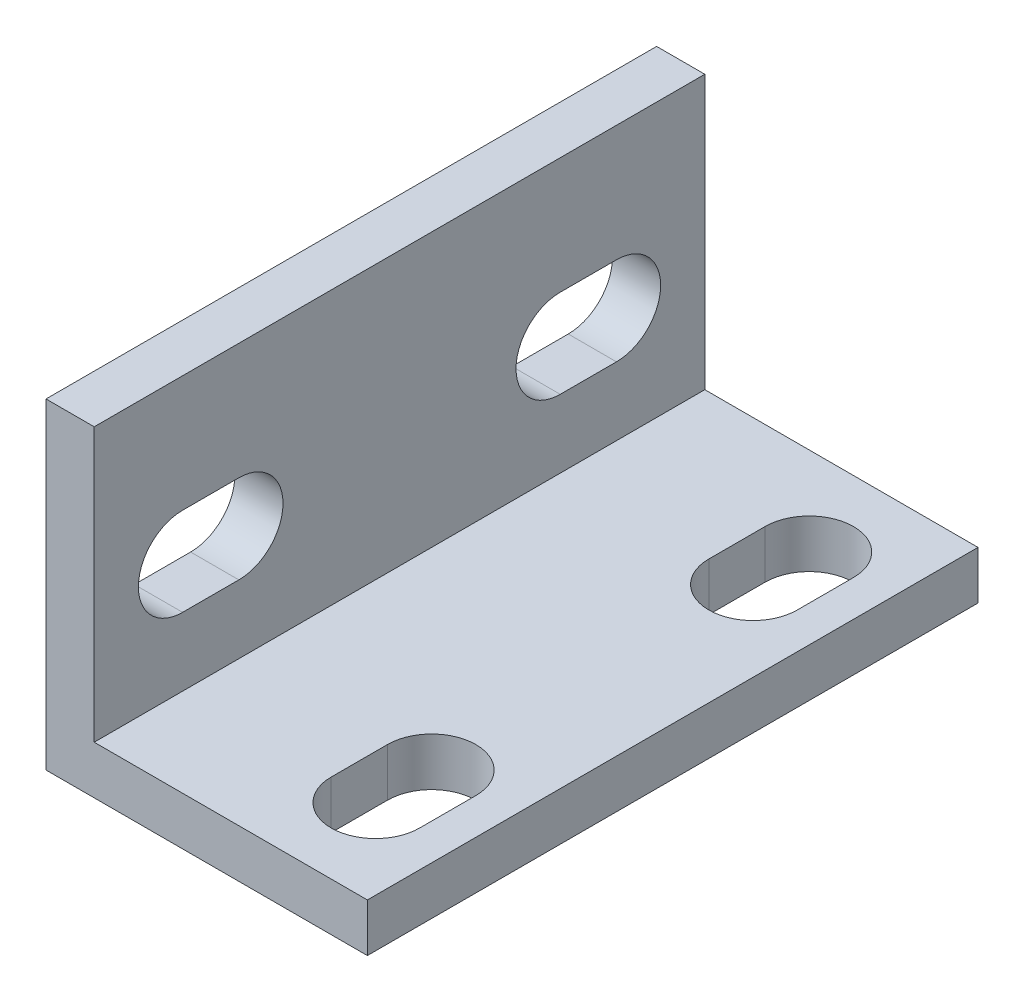
ISO-10303-21;
HEADER;
FILE_DESCRIPTION(('STEP AP214'),'2;1');
FILE_NAME('part.step','',(''),(''),'','','');
FILE_SCHEMA(('AUTOMOTIVE_DESIGN { 1 0 10303 214 1 1 1 1 }'));
ENDSEC;
DATA;
#1=APPLICATION_CONTEXT('core data for automotive mechanical design processes');
#2=APPLICATION_PROTOCOL_DEFINITION('international standard','automotive_design',2000,#1);
#3=PRODUCT_CONTEXT('',#1,'mechanical');
#4=PRODUCT('Part','Part','',(#3));
#5=PRODUCT_RELATED_PRODUCT_CATEGORY('part','',(#4));
#6=PRODUCT_DEFINITION_FORMATION('','',#4);
#7=PRODUCT_DEFINITION_CONTEXT('part definition',#1,'design');
#8=PRODUCT_DEFINITION('design','',#6,#7);
#9=PRODUCT_DEFINITION_SHAPE('','',#8);
#10=(LENGTH_UNIT() NAMED_UNIT(*) SI_UNIT(.MILLI.,.METRE.));
#11=(NAMED_UNIT(*) PLANE_ANGLE_UNIT() SI_UNIT($,.RADIAN.));
#12=(NAMED_UNIT(*) SI_UNIT($,.STERADIAN.) SOLID_ANGLE_UNIT());
#13=UNCERTAINTY_MEASURE_WITH_UNIT(LENGTH_MEASURE(1.E-05),#10,'distance_accuracy_value','');
#14=(GEOMETRIC_REPRESENTATION_CONTEXT(3) GLOBAL_UNCERTAINTY_ASSIGNED_CONTEXT((#13)) GLOBAL_UNIT_ASSIGNED_CONTEXT((#10,
#11,#12)) REPRESENTATION_CONTEXT('',''));
#15=CARTESIAN_POINT('',(0.,0.,0.));
#16=DIRECTION('',(0.,0.,1.));
#17=DIRECTION('',(1.,0.,0.));
#18=AXIS2_PLACEMENT_3D('',#15,#16,#17);
#19=CARTESIAN_POINT('',(10.,20.,-19.));
#20=DIRECTION('',(-1.,0.,0.));
#21=DIRECTION('',(0.,0.,1.));
#22=AXIS2_PLACEMENT_3D('',#19,#20,#21);
#23=PLANE('',#22);
#24=DIRECTION('',(0.,-1.,0.));
#25=VECTOR('',#24,1.);
#26=CARTESIAN_POINT('',(10.,20.,-19.));
#27=LINE('',#26,#25);
#28=CARTESIAN_POINT('',(10.,3.,-19.));
#29=VERTEX_POINT('',#28);
#30=CARTESIAN_POINT('',(10.,0.,-19.));
#31=VERTEX_POINT('',#30);
#32=EDGE_CURVE('E11',#29,#31,#27,.T.);
#33=ORIENTED_EDGE('',*,*,#32,.F.);
#34=DIRECTION('',(0.,0.,1.));
#35=VECTOR('',#34,1.);
#36=CARTESIAN_POINT('',(10.,3.,-19.));
#37=LINE('',#36,#35);
#38=CARTESIAN_POINT('',(10.,3.,19.));
#39=VERTEX_POINT('',#38);
#40=EDGE_CURVE('E332',#29,#39,#37,.T.);
#41=ORIENTED_EDGE('',*,*,#40,.T.);
#42=DIRECTION('',(0.,-1.,0.));
#43=VECTOR('',#42,1.);
#44=CARTESIAN_POINT('',(10.,20.,19.));
#45=LINE('',#44,#43);
#46=CARTESIAN_POINT('',(10.,0.,19.));
#47=VERTEX_POINT('',#46);
#48=EDGE_CURVE('E347',#39,#47,#45,.T.);
#49=ORIENTED_EDGE('',*,*,#48,.T.);
#50=DIRECTION('',(0.,0.,-1.));
#51=VECTOR('',#50,1.);
#52=CARTESIAN_POINT('',(10.,0.,-19.));
#53=LINE('',#52,#51);
#54=EDGE_CURVE('E335',#47,#31,#53,.T.);
#55=ORIENTED_EDGE('',*,*,#54,.T.);
#56=EDGE_LOOP('',(#33,#41,#49,#55));
#57=FACE_BOUND('',#56,.T.);
#58=ADVANCED_FACE('F39',(#57),#23,.F.);
#59=CARTESIAN_POINT('',(-10.,20.,-19.));
#60=DIRECTION('',(0.,0.,1.));
#61=DIRECTION('',(1.,0.,0.));
#62=AXIS2_PLACEMENT_3D('',#59,#60,#61);
#63=PLANE('',#62);
#64=DIRECTION('',(0.,-1.,0.));
#65=VECTOR('',#64,1.);
#66=CARTESIAN_POINT('',(-7.,20.,-19.));
#67=LINE('',#66,#65);
#68=CARTESIAN_POINT('',(-7.,20.,-19.));
#69=VERTEX_POINT('',#68);
#70=CARTESIAN_POINT('',(-7.,3.,-19.));
#71=VERTEX_POINT('',#70);
#72=EDGE_CURVE('E321',#69,#71,#67,.T.);
#73=ORIENTED_EDGE('',*,*,#72,.T.);
#74=DIRECTION('',(1.,0.,0.));
#75=VECTOR('',#74,1.);
#76=CARTESIAN_POINT('',(10.,3.,-19.));
#77=LINE('',#76,#75);
#78=EDGE_CURVE('E324',#71,#29,#77,.T.);
#79=ORIENTED_EDGE('',*,*,#78,.T.);
#80=ORIENTED_EDGE('',*,*,#32,.T.);
#81=DIRECTION('',(-1.,0.,0.));
#82=VECTOR('',#81,1.);
#83=CARTESIAN_POINT('',(-10.,0.,-19.));
#84=LINE('',#83,#82);
#85=CARTESIAN_POINT('',(-10.,0.,-19.));
#86=VERTEX_POINT('',#85);
#87=EDGE_CURVE('E350',#31,#86,#84,.T.);
#88=ORIENTED_EDGE('',*,*,#87,.T.);
#89=DIRECTION('',(0.,-1.,0.));
#90=VECTOR('',#89,1.);
#91=CARTESIAN_POINT('',(-10.,20.,-19.));
#92=LINE('',#91,#90);
#93=CARTESIAN_POINT('',(-10.,20.,-19.));
#94=VERTEX_POINT('',#93);
#95=EDGE_CURVE('E46',#94,#86,#92,.T.);
#96=ORIENTED_EDGE('',*,*,#95,.F.);
#97=DIRECTION('',(-1.,0.,0.));
#98=VECTOR('',#97,1.);
#99=CARTESIAN_POINT('',(-10.,20.,-19.));
#100=LINE('',#99,#98);
#101=EDGE_CURVE('E339',#69,#94,#100,.T.);
#102=ORIENTED_EDGE('',*,*,#101,.F.);
#103=EDGE_LOOP('',(#73,#79,#80,#88,#96,#102));
#104=FACE_BOUND('',#103,.T.);
#105=ADVANCED_FACE('F381',(#104),#63,.F.);
#106=CARTESIAN_POINT('',(-10.,20.,-19.));
#107=DIRECTION('',(1.,0.,0.));
#108=DIRECTION('',(0.,0.,-1.));
#109=AXIS2_PLACEMENT_3D('',#106,#107,#108);
#110=PLANE('',#109);
#111=DIRECTION('',(0.,0.,1.));
#112=VECTOR('',#111,1.);
#113=CARTESIAN_POINT('',(-10.,12.75,13.5));
#114=LINE('',#113,#112);
#115=CARTESIAN_POINT('',(-10.,12.75,10.));
#116=VERTEX_POINT('',#115);
#117=CARTESIAN_POINT('',(-10.,12.75,13.5));
#118=VERTEX_POINT('',#117);
#119=EDGE_CURVE('E198',#116,#118,#114,.T.);
#120=ORIENTED_EDGE('',*,*,#119,.T.);
#121=CARTESIAN_POINT('',(-10.,10.,13.5));
#122=DIRECTION('',(1.,0.,0.));
#123=DIRECTION('',(0.,1.,0.));
#124=AXIS2_PLACEMENT_3D('',#121,#122,#123);
#125=CIRCLE('',#124,2.75);
#126=CARTESIAN_POINT('',(-10.,7.25,13.5));
#127=VERTEX_POINT('',#126);
#128=EDGE_CURVE('E190',#118,#127,#125,.T.);
#129=ORIENTED_EDGE('',*,*,#128,.T.);
#130=DIRECTION('',(0.,0.,-1.));
#131=VECTOR('',#130,1.);
#132=CARTESIAN_POINT('',(-10.,7.25,13.5));
#133=LINE('',#132,#131);
#134=CARTESIAN_POINT('',(-10.,7.25,10.));
#135=VERTEX_POINT('',#134);
#136=EDGE_CURVE('E201',#127,#135,#133,.T.);
#137=ORIENTED_EDGE('',*,*,#136,.T.);
#138=CARTESIAN_POINT('',(-10.,9.99999999999999,10.));
#139=DIRECTION('',(1.,0.,0.));
#140=DIRECTION('',(0.,1.,0.));
#141=AXIS2_PLACEMENT_3D('',#138,#139,#140);
#142=CIRCLE('',#141,2.75);
#143=EDGE_CURVE('E53',#135,#116,#142,.T.);
#144=ORIENTED_EDGE('',*,*,#143,.T.);
#145=EDGE_LOOP('',(#120,#129,#137,#144));
#146=FACE_BOUND('',#145,.T.);
#147=DIRECTION('',(0.,0.,-1.));
#148=VECTOR('',#147,1.);
#149=CARTESIAN_POINT('',(-10.,7.25,-13.5));
#150=LINE('',#149,#148);
#151=CARTESIAN_POINT('',(-10.,7.25,-10.));
#152=VERTEX_POINT('',#151);
#153=CARTESIAN_POINT('',(-10.,7.25,-13.5));
#154=VERTEX_POINT('',#153);
#155=EDGE_CURVE('E231',#152,#154,#150,.T.);
#156=ORIENTED_EDGE('',*,*,#155,.T.);
#157=CARTESIAN_POINT('',(-10.,10.,-13.5));
#158=DIRECTION('',(1.,0.,0.));
#159=DIRECTION('',(0.,-1.,0.));
#160=AXIS2_PLACEMENT_3D('',#157,#158,#159);
#161=CIRCLE('',#160,2.75);
#162=CARTESIAN_POINT('',(-10.,12.75,-13.5));
#163=VERTEX_POINT('',#162);
#164=EDGE_CURVE('E242',#154,#163,#161,.T.);
#165=ORIENTED_EDGE('',*,*,#164,.T.);
#166=DIRECTION('',(0.,0.,1.));
#167=VECTOR('',#166,1.);
#168=CARTESIAN_POINT('',(-10.,12.75,-13.5));
#169=LINE('',#168,#167);
#170=CARTESIAN_POINT('',(-10.,12.75,-10.));
#171=VERTEX_POINT('',#170);
#172=EDGE_CURVE('E252',#163,#171,#169,.T.);
#173=ORIENTED_EDGE('',*,*,#172,.T.);
#174=CARTESIAN_POINT('',(-10.,9.99999999999999,-10.));
#175=DIRECTION('',(1.,0.,0.));
#176=DIRECTION('',(0.,-1.,0.));
#177=AXIS2_PLACEMENT_3D('',#174,#175,#176);
#178=CIRCLE('',#177,2.75);
#179=EDGE_CURVE('E61',#171,#152,#178,.T.);
#180=ORIENTED_EDGE('',*,*,#179,.T.);
#181=EDGE_LOOP('',(#156,#165,#173,#180));
#182=FACE_BOUND('',#181,.T.);
#183=DIRECTION('',(0.,0.,1.));
#184=VECTOR('',#183,1.);
#185=CARTESIAN_POINT('',(-10.,0.,-19.));
#186=LINE('',#185,#184);
#187=CARTESIAN_POINT('',(-9.99999999999999,0.,19.));
#188=VERTEX_POINT('',#187);
#189=EDGE_CURVE('E352',#86,#188,#186,.T.);
#190=ORIENTED_EDGE('',*,*,#189,.T.);
#191=DIRECTION('',(0.,-1.,0.));
#192=VECTOR('',#191,1.);
#193=CARTESIAN_POINT('',(-9.99999999999999,20.,19.));
#194=LINE('',#193,#192);
#195=CARTESIAN_POINT('',(-9.99999999999999,20.,19.));
#196=VERTEX_POINT('',#195);
#197=EDGE_CURVE('E357',#196,#188,#194,.T.);
#198=ORIENTED_EDGE('',*,*,#197,.F.);
#199=DIRECTION('',(0.,0.,1.));
#200=VECTOR('',#199,1.);
#201=CARTESIAN_POINT('',(-10.,20.,-19.));
#202=LINE('',#201,#200);
#203=EDGE_CURVE('E341',#94,#196,#202,.T.);
#204=ORIENTED_EDGE('',*,*,#203,.F.);
#205=ORIENTED_EDGE('',*,*,#95,.T.);
#206=EDGE_LOOP('',(#190,#198,#204,#205));
#207=FACE_BOUND('',#206,.T.);
#208=ADVANCED_FACE('F205',(#146,#182,#207),#110,.F.);
#209=CARTESIAN_POINT('',(-9.99999999999999,20.,19.));
#210=DIRECTION('',(0.,0.,-1.));
#211=DIRECTION('',(-1.,0.,0.));
#212=AXIS2_PLACEMENT_3D('',#209,#210,#211);
#213=PLANE('',#212);
#214=ORIENTED_EDGE('',*,*,#48,.F.);
#215=DIRECTION('',(1.,0.,0.));
#216=VECTOR('',#215,1.);
#217=CARTESIAN_POINT('',(10.,3.,19.));
#218=LINE('',#217,#216);
#219=CARTESIAN_POINT('',(-7.,3.,19.));
#220=VERTEX_POINT('',#219);
#221=EDGE_CURVE('E325',#220,#39,#218,.T.);
#222=ORIENTED_EDGE('',*,*,#221,.F.);
#223=DIRECTION('',(0.,-1.,0.));
#224=VECTOR('',#223,1.);
#225=CARTESIAN_POINT('',(-7.,20.,19.));
#226=LINE('',#225,#224);
#227=CARTESIAN_POINT('',(-7.,20.,19.));
#228=VERTEX_POINT('',#227);
#229=EDGE_CURVE('E284',#228,#220,#226,.T.);
#230=ORIENTED_EDGE('',*,*,#229,.F.);
#231=DIRECTION('',(1.,0.,0.));
#232=VECTOR('',#231,1.);
#233=CARTESIAN_POINT('',(-9.99999999999999,20.,19.));
#234=LINE('',#233,#232);
#235=EDGE_CURVE('E344',#196,#228,#234,.T.);
#236=ORIENTED_EDGE('',*,*,#235,.F.);
#237=ORIENTED_EDGE('',*,*,#197,.T.);
#238=DIRECTION('',(1.,0.,0.));
#239=VECTOR('',#238,1.);
#240=CARTESIAN_POINT('',(-9.99999999999999,0.,19.));
#241=LINE('',#240,#239);
#242=EDGE_CURVE('E342',#188,#47,#241,.T.);
#243=ORIENTED_EDGE('',*,*,#242,.T.);
#244=EDGE_LOOP('',(#214,#222,#230,#236,#237,#243));
#245=FACE_BOUND('',#244,.T.);
#246=ADVANCED_FACE('F374',(#245),#213,.F.);
#247=CARTESIAN_POINT('',(0.,20.,0.));
#248=DIRECTION('',(0.,1.,0.));
#249=DIRECTION('',(0.,0.,1.));
#250=AXIS2_PLACEMENT_3D('',#247,#248,#249);
#251=PLANE('',#250);
#252=DIRECTION('',(0.,0.,1.));
#253=VECTOR('',#252,1.);
#254=CARTESIAN_POINT('',(-7.,20.,-19.));
#255=LINE('',#254,#253);
#256=EDGE_CURVE('E328',#69,#228,#255,.T.);
#257=ORIENTED_EDGE('',*,*,#256,.F.);
#258=ORIENTED_EDGE('',*,*,#101,.T.);
#259=ORIENTED_EDGE('',*,*,#203,.T.);
#260=ORIENTED_EDGE('',*,*,#235,.T.);
#261=EDGE_LOOP('',(#257,#258,#259,#260));
#262=FACE_BOUND('',#261,.T.);
#263=ADVANCED_FACE('F380',(#262),#251,.T.);
#264=CARTESIAN_POINT('',(0.,0.,0.));
#265=DIRECTION('',(0.,1.,0.));
#266=DIRECTION('',(0.,0.,1.));
#267=AXIS2_PLACEMENT_3D('',#264,#265,#266);
#268=PLANE('',#267);
#269=DIRECTION('',(0.,0.,-1.));
#270=VECTOR('',#269,1.);
#271=CARTESIAN_POINT('',(7.75,0.,10.));
#272=LINE('',#271,#270);
#273=CARTESIAN_POINT('',(7.75,0.,13.5));
#274=VERTEX_POINT('',#273);
#275=CARTESIAN_POINT('',(7.75,0.,10.));
#276=VERTEX_POINT('',#275);
#277=EDGE_CURVE('E267',#274,#276,#272,.T.);
#278=ORIENTED_EDGE('',*,*,#277,.T.);
#279=CARTESIAN_POINT('',(5.,0.,10.));
#280=DIRECTION('',(0.,1.,0.));
#281=DIRECTION('',(-1.,0.,0.));
#282=AXIS2_PLACEMENT_3D('',#279,#280,#281);
#283=CIRCLE('',#282,2.75);
#284=CARTESIAN_POINT('',(2.25,0.,10.));
#285=VERTEX_POINT('',#284);
#286=EDGE_CURVE('E257',#276,#285,#283,.T.);
#287=ORIENTED_EDGE('',*,*,#286,.T.);
#288=DIRECTION('',(0.,0.,1.));
#289=VECTOR('',#288,1.);
#290=CARTESIAN_POINT('',(2.25,0.,10.));
#291=LINE('',#290,#289);
#292=CARTESIAN_POINT('',(2.25,0.,13.5));
#293=VERTEX_POINT('',#292);
#294=EDGE_CURVE('E260',#285,#293,#291,.T.);
#295=ORIENTED_EDGE('',*,*,#294,.T.);
#296=CARTESIAN_POINT('',(5.,0.,13.5));
#297=DIRECTION('',(0.,1.,0.));
#298=DIRECTION('',(-1.,0.,0.));
#299=AXIS2_PLACEMENT_3D('',#296,#297,#298);
#300=CIRCLE('',#299,2.75);
#301=EDGE_CURVE('E264',#293,#274,#300,.T.);
#302=ORIENTED_EDGE('',*,*,#301,.T.);
#303=EDGE_LOOP('',(#278,#287,#295,#302));
#304=FACE_BOUND('',#303,.T.);
#305=DIRECTION('',(0.,0.,1.));
#306=VECTOR('',#305,1.);
#307=CARTESIAN_POINT('',(2.25000000000001,0.,-10.));
#308=LINE('',#307,#306);
#309=CARTESIAN_POINT('',(2.25000000000001,0.,-13.5));
#310=VERTEX_POINT('',#309);
#311=CARTESIAN_POINT('',(2.25000000000001,0.,-10.));
#312=VERTEX_POINT('',#311);
#313=EDGE_CURVE('E294',#310,#312,#308,.T.);
#314=ORIENTED_EDGE('',*,*,#313,.T.);
#315=CARTESIAN_POINT('',(5.00000000000001,0.,-9.99999999999999));
#316=DIRECTION('',(0.,1.,0.));
#317=DIRECTION('',(1.,0.,0.));
#318=AXIS2_PLACEMENT_3D('',#315,#316,#317);
#319=CIRCLE('',#318,2.75);
#320=CARTESIAN_POINT('',(7.75000000000001,0.,-9.99999999999999));
#321=VERTEX_POINT('',#320);
#322=EDGE_CURVE('E304',#312,#321,#319,.T.);
#323=ORIENTED_EDGE('',*,*,#322,.T.);
#324=DIRECTION('',(0.,0.,-1.));
#325=VECTOR('',#324,1.);
#326=CARTESIAN_POINT('',(7.75000000000001,0.,-9.99999999999999));
#327=LINE('',#326,#325);
#328=CARTESIAN_POINT('',(7.75000000000001,0.,-13.5));
#329=VERTEX_POINT('',#328);
#330=EDGE_CURVE('E316',#321,#329,#327,.T.);
#331=ORIENTED_EDGE('',*,*,#330,.T.);
#332=CARTESIAN_POINT('',(5.00000000000001,0.,-13.5));
#333=DIRECTION('',(0.,1.,0.));
#334=DIRECTION('',(1.,0.,0.));
#335=AXIS2_PLACEMENT_3D('',#332,#333,#334);
#336=CIRCLE('',#335,2.75);
#337=EDGE_CURVE('E313',#329,#310,#336,.T.);
#338=ORIENTED_EDGE('',*,*,#337,.T.);
#339=EDGE_LOOP('',(#314,#323,#331,#338));
#340=FACE_BOUND('',#339,.T.);
#341=ORIENTED_EDGE('',*,*,#54,.F.);
#342=ORIENTED_EDGE('',*,*,#242,.F.);
#343=ORIENTED_EDGE('',*,*,#189,.F.);
#344=ORIENTED_EDGE('',*,*,#87,.F.);
#345=EDGE_LOOP('',(#341,#342,#343,#344));
#346=FACE_BOUND('',#345,.T.);
#347=ADVANCED_FACE('F371',(#304,#340,#346),#268,.F.);
#348=CARTESIAN_POINT('',(10.,3.,-19.));
#349=DIRECTION('',(0.,-1.,0.));
#350=DIRECTION('',(1.,0.,0.));
#351=AXIS2_PLACEMENT_3D('',#348,#349,#350);
#352=PLANE('',#351);
#353=DIRECTION('',(0.,0.,1.));
#354=VECTOR('',#353,1.);
#355=CARTESIAN_POINT('',(2.25,3.,10.));
#356=LINE('',#355,#354);
#357=CARTESIAN_POINT('',(2.25,3.,10.));
#358=VERTEX_POINT('',#357);
#359=CARTESIAN_POINT('',(2.25,3.,13.5));
#360=VERTEX_POINT('',#359);
#361=EDGE_CURVE('E273',#358,#360,#356,.T.);
#362=ORIENTED_EDGE('',*,*,#361,.F.);
#363=CARTESIAN_POINT('',(5.,3.,10.));
#364=DIRECTION('',(0.,1.,0.));
#365=DIRECTION('',(-1.,0.,0.));
#366=AXIS2_PLACEMENT_3D('',#363,#364,#365);
#367=CIRCLE('',#366,2.75);
#368=CARTESIAN_POINT('',(7.75,3.,10.));
#369=VERTEX_POINT('',#368);
#370=EDGE_CURVE('E271',#369,#358,#367,.T.);
#371=ORIENTED_EDGE('',*,*,#370,.F.);
#372=DIRECTION('',(0.,0.,-1.));
#373=VECTOR('',#372,1.);
#374=CARTESIAN_POINT('',(7.75,3.,10.));
#375=LINE('',#374,#373);
#376=CARTESIAN_POINT('',(7.75,3.,13.5));
#377=VERTEX_POINT('',#376);
#378=EDGE_CURVE('E261',#377,#369,#375,.T.);
#379=ORIENTED_EDGE('',*,*,#378,.F.);
#380=CARTESIAN_POINT('',(5.,3.,13.5));
#381=DIRECTION('',(0.,1.,0.));
#382=DIRECTION('',(-1.,0.,0.));
#383=AXIS2_PLACEMENT_3D('',#380,#381,#382);
#384=CIRCLE('',#383,2.75);
#385=EDGE_CURVE('E277',#360,#377,#384,.T.);
#386=ORIENTED_EDGE('',*,*,#385,.F.);
#387=EDGE_LOOP('',(#362,#371,#379,#386));
#388=FACE_BOUND('',#387,.T.);
#389=DIRECTION('',(0.,0.,-1.));
#390=VECTOR('',#389,1.);
#391=CARTESIAN_POINT('',(7.75000000000001,3.,-9.99999999999999));
#392=LINE('',#391,#390);
#393=CARTESIAN_POINT('',(7.75000000000001,3.,-9.99999999999999));
#394=VERTEX_POINT('',#393);
#395=CARTESIAN_POINT('',(7.75000000000001,3.,-13.5));
#396=VERTEX_POINT('',#395);
#397=EDGE_CURVE('E307',#394,#396,#392,.T.);
#398=ORIENTED_EDGE('',*,*,#397,.F.);
#399=CARTESIAN_POINT('',(5.00000000000001,3.,-9.99999999999999));
#400=DIRECTION('',(0.,1.,0.));
#401=DIRECTION('',(1.,0.,0.));
#402=AXIS2_PLACEMENT_3D('',#399,#400,#401);
#403=CIRCLE('',#402,2.75);
#404=CARTESIAN_POINT('',(2.25000000000001,3.,-10.));
#405=VERTEX_POINT('',#404);
#406=EDGE_CURVE('E274',#405,#394,#403,.T.);
#407=ORIENTED_EDGE('',*,*,#406,.F.);
#408=DIRECTION('',(0.,0.,1.));
#409=VECTOR('',#408,1.);
#410=CARTESIAN_POINT('',(2.25000000000001,3.,-10.));
#411=LINE('',#410,#409);
#412=CARTESIAN_POINT('',(2.25000000000001,3.,-13.5));
#413=VERTEX_POINT('',#412);
#414=EDGE_CURVE('E300',#413,#405,#411,.T.);
#415=ORIENTED_EDGE('',*,*,#414,.F.);
#416=CARTESIAN_POINT('',(5.00000000000001,3.,-13.5));
#417=DIRECTION('',(0.,1.,0.));
#418=DIRECTION('',(1.,0.,0.));
#419=AXIS2_PLACEMENT_3D('',#416,#417,#418);
#420=CIRCLE('',#419,2.75);
#421=EDGE_CURVE('E303',#396,#413,#420,.T.);
#422=ORIENTED_EDGE('',*,*,#421,.F.);
#423=EDGE_LOOP('',(#398,#407,#415,#422));
#424=FACE_BOUND('',#423,.T.);
#425=ORIENTED_EDGE('',*,*,#221,.T.);
#426=ORIENTED_EDGE('',*,*,#40,.F.);
#427=ORIENTED_EDGE('',*,*,#78,.F.);
#428=DIRECTION('',(0.,0.,1.));
#429=VECTOR('',#428,1.);
#430=CARTESIAN_POINT('',(-7.,3.,-19.));
#431=LINE('',#430,#429);
#432=EDGE_CURVE('E336',#71,#220,#431,.T.);
#433=ORIENTED_EDGE('',*,*,#432,.T.);
#434=EDGE_LOOP('',(#425,#426,#427,#433));
#435=FACE_BOUND('',#434,.T.);
#436=ADVANCED_FACE('F387',(#388,#424,#435),#352,.F.);
#437=CARTESIAN_POINT('',(-7.,20.,-19.));
#438=DIRECTION('',(-1.,0.,0.));
#439=DIRECTION('',(0.,-1.,0.));
#440=AXIS2_PLACEMENT_3D('',#437,#438,#439);
#441=PLANE('',#440);
#442=DIRECTION('',(0.,0.,-1.));
#443=VECTOR('',#442,1.);
#444=CARTESIAN_POINT('',(-7.,7.25,13.5));
#445=LINE('',#444,#443);
#446=CARTESIAN_POINT('',(-7.,7.25,13.5));
#447=VERTEX_POINT('',#446);
#448=CARTESIAN_POINT('',(-7.,7.25,10.));
#449=VERTEX_POINT('',#448);
#450=EDGE_CURVE('E217',#447,#449,#445,.T.);
#451=ORIENTED_EDGE('',*,*,#450,.F.);
#452=CARTESIAN_POINT('',(-7.,10.,13.5));
#453=DIRECTION('',(1.,0.,0.));
#454=DIRECTION('',(0.,1.,0.));
#455=AXIS2_PLACEMENT_3D('',#452,#453,#454);
#456=CIRCLE('',#455,2.75);
#457=CARTESIAN_POINT('',(-7.,12.75,13.5));
#458=VERTEX_POINT('',#457);
#459=EDGE_CURVE('E193',#458,#447,#456,.T.);
#460=ORIENTED_EDGE('',*,*,#459,.F.);
#461=DIRECTION('',(0.,0.,1.));
#462=VECTOR('',#461,1.);
#463=CARTESIAN_POINT('',(-7.,12.75,13.5));
#464=LINE('',#463,#462);
#465=CARTESIAN_POINT('',(-7.,12.75,10.));
#466=VERTEX_POINT('',#465);
#467=EDGE_CURVE('E208',#466,#458,#464,.T.);
#468=ORIENTED_EDGE('',*,*,#467,.F.);
#469=CARTESIAN_POINT('',(-7.,9.99999999999999,10.));
#470=DIRECTION('',(1.,0.,0.));
#471=DIRECTION('',(0.,1.,0.));
#472=AXIS2_PLACEMENT_3D('',#469,#470,#471);
#473=CIRCLE('',#472,2.75);
#474=EDGE_CURVE('E211',#449,#466,#473,.T.);
#475=ORIENTED_EDGE('',*,*,#474,.F.);
#476=EDGE_LOOP('',(#451,#460,#468,#475));
#477=FACE_BOUND('',#476,.T.);
#478=DIRECTION('',(0.,0.,1.));
#479=VECTOR('',#478,1.);
#480=CARTESIAN_POINT('',(-7.,12.75,-13.5));
#481=LINE('',#480,#479);
#482=CARTESIAN_POINT('',(-7.,12.75,-13.5));
#483=VERTEX_POINT('',#482);
#484=CARTESIAN_POINT('',(-7.,12.75,-10.));
#485=VERTEX_POINT('',#484);
#486=EDGE_CURVE('E245',#483,#485,#481,.T.);
#487=ORIENTED_EDGE('',*,*,#486,.F.);
#488=CARTESIAN_POINT('',(-7.,10.,-13.5));
#489=DIRECTION('',(1.,0.,0.));
#490=DIRECTION('',(0.,-1.,0.));
#491=AXIS2_PLACEMENT_3D('',#488,#489,#490);
#492=CIRCLE('',#491,2.75);
#493=CARTESIAN_POINT('',(-7.,7.25,-13.5));
#494=VERTEX_POINT('',#493);
#495=EDGE_CURVE('E218',#494,#483,#492,.T.);
#496=ORIENTED_EDGE('',*,*,#495,.F.);
#497=DIRECTION('',(0.,0.,-1.));
#498=VECTOR('',#497,1.);
#499=CARTESIAN_POINT('',(-7.,7.25,-13.5));
#500=LINE('',#499,#498);
#501=CARTESIAN_POINT('',(-7.,7.25,-10.));
#502=VERTEX_POINT('',#501);
#503=EDGE_CURVE('E238',#502,#494,#500,.T.);
#504=ORIENTED_EDGE('',*,*,#503,.F.);
#505=CARTESIAN_POINT('',(-7.,9.99999999999999,-10.));
#506=DIRECTION('',(1.,0.,0.));
#507=DIRECTION('',(0.,-1.,0.));
#508=AXIS2_PLACEMENT_3D('',#505,#506,#507);
#509=CIRCLE('',#508,2.75);
#510=EDGE_CURVE('E241',#485,#502,#509,.T.);
#511=ORIENTED_EDGE('',*,*,#510,.F.);
#512=EDGE_LOOP('',(#487,#496,#504,#511));
#513=FACE_BOUND('',#512,.T.);
#514=ORIENTED_EDGE('',*,*,#229,.T.);
#515=ORIENTED_EDGE('',*,*,#432,.F.);
#516=ORIENTED_EDGE('',*,*,#72,.F.);
#517=ORIENTED_EDGE('',*,*,#256,.T.);
#518=EDGE_LOOP('',(#514,#515,#516,#517));
#519=FACE_BOUND('',#518,.T.);
#520=ADVANCED_FACE('F385',(#477,#513,#519),#441,.F.);
#521=CARTESIAN_POINT('',(5.00000000000001,0.,-9.99999999999999));
#522=DIRECTION('',(0.,1.,0.));
#523=DIRECTION('',(-1.,0.,0.));
#524=AXIS2_PLACEMENT_3D('',#521,#522,#523);
#525=CYLINDRICAL_SURFACE('',#524,2.75);
#526=ORIENTED_EDGE('',*,*,#406,.T.);
#527=DIRECTION('',(0.,1.,0.));
#528=VECTOR('',#527,1.);
#529=CARTESIAN_POINT('',(7.75000000000001,0.,-9.99999999999999));
#530=LINE('',#529,#528);
#531=EDGE_CURVE('E291',#321,#394,#530,.T.);
#532=ORIENTED_EDGE('',*,*,#531,.F.);
#533=ORIENTED_EDGE('',*,*,#322,.F.);
#534=DIRECTION('',(0.,1.,0.));
#535=VECTOR('',#534,1.);
#536=CARTESIAN_POINT('',(2.25000000000001,0.,-10.));
#537=LINE('',#536,#535);
#538=EDGE_CURVE('E224',#312,#405,#537,.T.);
#539=ORIENTED_EDGE('',*,*,#538,.T.);
#540=EDGE_LOOP('',(#526,#532,#533,#539));
#541=FACE_BOUND('',#540,.T.);
#542=ADVANCED_FACE('F407',(#541),#525,.F.);
#543=CARTESIAN_POINT('',(2.25000000000001,0.,-10.));
#544=DIRECTION('',(-1.,0.,0.));
#545=DIRECTION('',(0.,0.,1.));
#546=AXIS2_PLACEMENT_3D('',#543,#544,#545);
#547=PLANE('',#546);
#548=ORIENTED_EDGE('',*,*,#414,.T.);
#549=ORIENTED_EDGE('',*,*,#538,.F.);
#550=ORIENTED_EDGE('',*,*,#313,.F.);
#551=DIRECTION('',(0.,1.,0.));
#552=VECTOR('',#551,1.);
#553=CARTESIAN_POINT('',(2.25000000000001,0.,-13.5));
#554=LINE('',#553,#552);
#555=EDGE_CURVE('E297',#310,#413,#554,.T.);
#556=ORIENTED_EDGE('',*,*,#555,.T.);
#557=EDGE_LOOP('',(#548,#549,#550,#556));
#558=FACE_BOUND('',#557,.T.);
#559=ADVANCED_FACE('F412',(#558),#547,.F.);
#560=CARTESIAN_POINT('',(5.00000000000001,0.,-13.5));
#561=DIRECTION('',(0.,1.,0.));
#562=DIRECTION('',(-1.,0.,0.));
#563=AXIS2_PLACEMENT_3D('',#560,#561,#562);
#564=CYLINDRICAL_SURFACE('',#563,2.75);
#565=ORIENTED_EDGE('',*,*,#421,.T.);
#566=ORIENTED_EDGE('',*,*,#555,.F.);
#567=ORIENTED_EDGE('',*,*,#337,.F.);
#568=DIRECTION('',(0.,1.,0.));
#569=VECTOR('',#568,1.);
#570=CARTESIAN_POINT('',(7.75000000000001,0.,-13.5));
#571=LINE('',#570,#569);
#572=EDGE_CURVE('E295',#329,#396,#571,.T.);
#573=ORIENTED_EDGE('',*,*,#572,.T.);
#574=EDGE_LOOP('',(#565,#566,#567,#573));
#575=FACE_BOUND('',#574,.T.);
#576=ADVANCED_FACE('F415',(#575),#564,.F.);
#577=CARTESIAN_POINT('',(7.75000000000001,0.,-9.99999999999999));
#578=DIRECTION('',(1.,0.,0.));
#579=DIRECTION('',(0.,0.,-1.));
#580=AXIS2_PLACEMENT_3D('',#577,#578,#579);
#581=PLANE('',#580);
#582=ORIENTED_EDGE('',*,*,#397,.T.);
#583=ORIENTED_EDGE('',*,*,#572,.F.);
#584=ORIENTED_EDGE('',*,*,#330,.F.);
#585=ORIENTED_EDGE('',*,*,#531,.T.);
#586=EDGE_LOOP('',(#582,#583,#584,#585));
#587=FACE_BOUND('',#586,.T.);
#588=ADVANCED_FACE('F419',(#587),#581,.F.);
#589=CARTESIAN_POINT('',(5.,0.,10.));
#590=DIRECTION('',(0.,1.,0.));
#591=DIRECTION('',(-1.,0.,0.));
#592=AXIS2_PLACEMENT_3D('',#589,#590,#591);
#593=CYLINDRICAL_SURFACE('',#592,2.75);
#594=ORIENTED_EDGE('',*,*,#370,.T.);
#595=DIRECTION('',(0.,1.,0.));
#596=VECTOR('',#595,1.);
#597=CARTESIAN_POINT('',(2.25,0.,10.));
#598=LINE('',#597,#596);
#599=EDGE_CURVE('E270',#285,#358,#598,.T.);
#600=ORIENTED_EDGE('',*,*,#599,.F.);
#601=ORIENTED_EDGE('',*,*,#286,.F.);
#602=DIRECTION('',(0.,1.,0.));
#603=VECTOR('',#602,1.);
#604=CARTESIAN_POINT('',(7.75,0.,10.));
#605=LINE('',#604,#603);
#606=EDGE_CURVE('E282',#276,#369,#605,.T.);
#607=ORIENTED_EDGE('',*,*,#606,.T.);
#608=EDGE_LOOP('',(#594,#600,#601,#607));
#609=FACE_BOUND('',#608,.T.);
#610=ADVANCED_FACE('F423',(#609),#593,.F.);
#611=CARTESIAN_POINT('',(7.75,0.,10.));
#612=DIRECTION('',(1.,0.,0.));
#613=DIRECTION('',(0.,1.,0.));
#614=AXIS2_PLACEMENT_3D('',#611,#612,#613);
#615=PLANE('',#614);
#616=ORIENTED_EDGE('',*,*,#378,.T.);
#617=ORIENTED_EDGE('',*,*,#606,.F.);
#618=ORIENTED_EDGE('',*,*,#277,.F.);
#619=DIRECTION('',(0.,1.,0.));
#620=VECTOR('',#619,1.);
#621=CARTESIAN_POINT('',(7.75,0.,13.5));
#622=LINE('',#621,#620);
#623=EDGE_CURVE('E285',#274,#377,#622,.T.);
#624=ORIENTED_EDGE('',*,*,#623,.T.);
#625=EDGE_LOOP('',(#616,#617,#618,#624));
#626=FACE_BOUND('',#625,.T.);
#627=ADVANCED_FACE('F430',(#626),#615,.F.);
#628=CARTESIAN_POINT('',(5.,0.,13.5));
#629=DIRECTION('',(0.,1.,0.));
#630=DIRECTION('',(-1.,0.,0.));
#631=AXIS2_PLACEMENT_3D('',#628,#629,#630);
#632=CYLINDRICAL_SURFACE('',#631,2.75);
#633=ORIENTED_EDGE('',*,*,#385,.T.);
#634=ORIENTED_EDGE('',*,*,#623,.F.);
#635=ORIENTED_EDGE('',*,*,#301,.F.);
#636=DIRECTION('',(0.,1.,0.));
#637=VECTOR('',#636,1.);
#638=CARTESIAN_POINT('',(2.25,0.,13.5));
#639=LINE('',#638,#637);
#640=EDGE_CURVE('E287',#293,#360,#639,.T.);
#641=ORIENTED_EDGE('',*,*,#640,.T.);
#642=EDGE_LOOP('',(#633,#634,#635,#641));
#643=FACE_BOUND('',#642,.T.);
#644=ADVANCED_FACE('F436',(#643),#632,.F.);
#645=CARTESIAN_POINT('',(2.25,0.,10.));
#646=DIRECTION('',(-1.,0.,0.));
#647=DIRECTION('',(0.,0.,1.));
#648=AXIS2_PLACEMENT_3D('',#645,#646,#647);
#649=PLANE('',#648);
#650=ORIENTED_EDGE('',*,*,#361,.T.);
#651=ORIENTED_EDGE('',*,*,#640,.F.);
#652=ORIENTED_EDGE('',*,*,#294,.F.);
#653=ORIENTED_EDGE('',*,*,#599,.T.);
#654=EDGE_LOOP('',(#650,#651,#652,#653));
#655=FACE_BOUND('',#654,.T.);
#656=ADVANCED_FACE('F432',(#655),#649,.F.);
#657=CARTESIAN_POINT('',(-10.,10.,-13.5));
#658=DIRECTION('',(1.,0.,0.));
#659=DIRECTION('',(0.,1.,0.));
#660=AXIS2_PLACEMENT_3D('',#657,#658,#659);
#661=CYLINDRICAL_SURFACE('',#660,2.75);
#662=ORIENTED_EDGE('',*,*,#495,.T.);
#663=DIRECTION('',(1.,0.,0.));
#664=VECTOR('',#663,1.);
#665=CARTESIAN_POINT('',(-10.,12.75,-13.5));
#666=LINE('',#665,#664);
#667=EDGE_CURVE('E228',#163,#483,#666,.T.);
#668=ORIENTED_EDGE('',*,*,#667,.F.);
#669=ORIENTED_EDGE('',*,*,#164,.F.);
#670=DIRECTION('',(1.,0.,0.));
#671=VECTOR('',#670,1.);
#672=CARTESIAN_POINT('',(-10.,7.25,-13.5));
#673=LINE('',#672,#671);
#674=EDGE_CURVE('E236',#154,#494,#673,.T.);
#675=ORIENTED_EDGE('',*,*,#674,.T.);
#676=EDGE_LOOP('',(#662,#668,#669,#675));
#677=FACE_BOUND('',#676,.T.);
#678=ADVANCED_FACE('F435',(#677),#661,.F.);
#679=CARTESIAN_POINT('',(-10.,7.25,-13.5));
#680=DIRECTION('',(0.,-1.,0.));
#681=DIRECTION('',(1.,0.,0.));
#682=AXIS2_PLACEMENT_3D('',#679,#680,#681);
#683=PLANE('',#682);
#684=ORIENTED_EDGE('',*,*,#503,.T.);
#685=ORIENTED_EDGE('',*,*,#674,.F.);
#686=ORIENTED_EDGE('',*,*,#155,.F.);
#687=DIRECTION('',(1.,0.,0.));
#688=VECTOR('',#687,1.);
#689=CARTESIAN_POINT('',(-10.,7.25,-10.));
#690=LINE('',#689,#688);
#691=EDGE_CURVE('E234',#152,#502,#690,.T.);
#692=ORIENTED_EDGE('',*,*,#691,.T.);
#693=EDGE_LOOP('',(#684,#685,#686,#692));
#694=FACE_BOUND('',#693,.T.);
#695=ADVANCED_FACE('F444',(#694),#683,.F.);
#696=CARTESIAN_POINT('',(-10.,9.99999999999999,-10.));
#697=DIRECTION('',(1.,0.,0.));
#698=DIRECTION('',(0.,1.,0.));
#699=AXIS2_PLACEMENT_3D('',#696,#697,#698);
#700=CYLINDRICAL_SURFACE('',#699,2.75);
#701=ORIENTED_EDGE('',*,*,#510,.T.);
#702=ORIENTED_EDGE('',*,*,#691,.F.);
#703=ORIENTED_EDGE('',*,*,#179,.F.);
#704=DIRECTION('',(1.,0.,0.));
#705=VECTOR('',#704,1.);
#706=CARTESIAN_POINT('',(-10.,12.75,-10.));
#707=LINE('',#706,#705);
#708=EDGE_CURVE('E232',#171,#485,#707,.T.);
#709=ORIENTED_EDGE('',*,*,#708,.T.);
#710=EDGE_LOOP('',(#701,#702,#703,#709));
#711=FACE_BOUND('',#710,.T.);
#712=ADVANCED_FACE('F447',(#711),#700,.F.);
#713=CARTESIAN_POINT('',(-10.,12.75,-13.5));
#714=DIRECTION('',(0.,1.,0.));
#715=DIRECTION('',(-1.,0.,0.));
#716=AXIS2_PLACEMENT_3D('',#713,#714,#715);
#717=PLANE('',#716);
#718=ORIENTED_EDGE('',*,*,#486,.T.);
#719=ORIENTED_EDGE('',*,*,#708,.F.);
#720=ORIENTED_EDGE('',*,*,#172,.F.);
#721=ORIENTED_EDGE('',*,*,#667,.T.);
#722=EDGE_LOOP('',(#718,#719,#720,#721));
#723=FACE_BOUND('',#722,.T.);
#724=ADVANCED_FACE('F451',(#723),#717,.F.);
#725=CARTESIAN_POINT('',(-10.,10.,13.5));
#726=DIRECTION('',(1.,0.,0.));
#727=DIRECTION('',(0.,1.,0.));
#728=AXIS2_PLACEMENT_3D('',#725,#726,#727);
#729=CYLINDRICAL_SURFACE('',#728,2.75);
#730=ORIENTED_EDGE('',*,*,#459,.T.);
#731=DIRECTION('',(1.,0.,0.));
#732=VECTOR('',#731,1.);
#733=CARTESIAN_POINT('',(-10.,7.25,13.5));
#734=LINE('',#733,#732);
#735=EDGE_CURVE('E186',#127,#447,#734,.T.);
#736=ORIENTED_EDGE('',*,*,#735,.F.);
#737=ORIENTED_EDGE('',*,*,#128,.F.);
#738=DIRECTION('',(1.,0.,0.));
#739=VECTOR('',#738,1.);
#740=CARTESIAN_POINT('',(-10.,12.75,13.5));
#741=LINE('',#740,#739);
#742=EDGE_CURVE('E222',#118,#458,#741,.T.);
#743=ORIENTED_EDGE('',*,*,#742,.T.);
#744=EDGE_LOOP('',(#730,#736,#737,#743));
#745=FACE_BOUND('',#744,.T.);
#746=ADVANCED_FACE('F188',(#745),#729,.F.);
#747=CARTESIAN_POINT('',(-10.,12.75,13.5));
#748=DIRECTION('',(0.,1.,0.));
#749=DIRECTION('',(-1.,0.,0.));
#750=AXIS2_PLACEMENT_3D('',#747,#748,#749);
#751=PLANE('',#750);
#752=ORIENTED_EDGE('',*,*,#467,.T.);
#753=ORIENTED_EDGE('',*,*,#742,.F.);
#754=ORIENTED_EDGE('',*,*,#119,.F.);
#755=DIRECTION('',(1.,0.,0.));
#756=VECTOR('',#755,1.);
#757=CARTESIAN_POINT('',(-10.,12.75,10.));
#758=LINE('',#757,#756);
#759=EDGE_CURVE('E225',#116,#466,#758,.T.);
#760=ORIENTED_EDGE('',*,*,#759,.T.);
#761=EDGE_LOOP('',(#752,#753,#754,#760));
#762=FACE_BOUND('',#761,.T.);
#763=ADVANCED_FACE('F460',(#762),#751,.F.);
#764=CARTESIAN_POINT('',(-10.,9.99999999999999,10.));
#765=DIRECTION('',(1.,0.,0.));
#766=DIRECTION('',(0.,1.,0.));
#767=AXIS2_PLACEMENT_3D('',#764,#765,#766);
#768=CYLINDRICAL_SURFACE('',#767,2.75);
#769=ORIENTED_EDGE('',*,*,#474,.T.);
#770=ORIENTED_EDGE('',*,*,#759,.F.);
#771=ORIENTED_EDGE('',*,*,#143,.F.);
#772=DIRECTION('',(1.,0.,0.));
#773=VECTOR('',#772,1.);
#774=CARTESIAN_POINT('',(-10.,7.25,10.));
#775=LINE('',#774,#773);
#776=EDGE_CURVE('E197',#135,#449,#775,.T.);
#777=ORIENTED_EDGE('',*,*,#776,.T.);
#778=EDGE_LOOP('',(#769,#770,#771,#777));
#779=FACE_BOUND('',#778,.T.);
#780=ADVANCED_FACE('F463',(#779),#768,.F.);
#781=CARTESIAN_POINT('',(-10.,7.25,13.5));
#782=DIRECTION('',(0.,-1.,0.));
#783=DIRECTION('',(1.,0.,0.));
#784=AXIS2_PLACEMENT_3D('',#781,#782,#783);
#785=PLANE('',#784);
#786=ORIENTED_EDGE('',*,*,#450,.T.);
#787=ORIENTED_EDGE('',*,*,#776,.F.);
#788=ORIENTED_EDGE('',*,*,#136,.F.);
#789=ORIENTED_EDGE('',*,*,#735,.T.);
#790=EDGE_LOOP('',(#786,#787,#788,#789));
#791=FACE_BOUND('',#790,.T.);
#792=ADVANCED_FACE('F202',(#791),#785,.F.);
#793=CLOSED_SHELL('',(#58,#105,#208,#246,#263,#347,#436,#520,#542,#559,#576,#588,#610,#627,#644,
#656,#678,#695,#712,#724,#746,#763,#780,#792));
#794=MANIFOLD_SOLID_BREP('B2',#793);
#795=ADVANCED_BREP_SHAPE_REPRESENTATION('',(#18,#794),#14);
#796=SHAPE_DEFINITION_REPRESENTATION(#9,#795);
ENDSEC;
END-ISO-10303-21;
